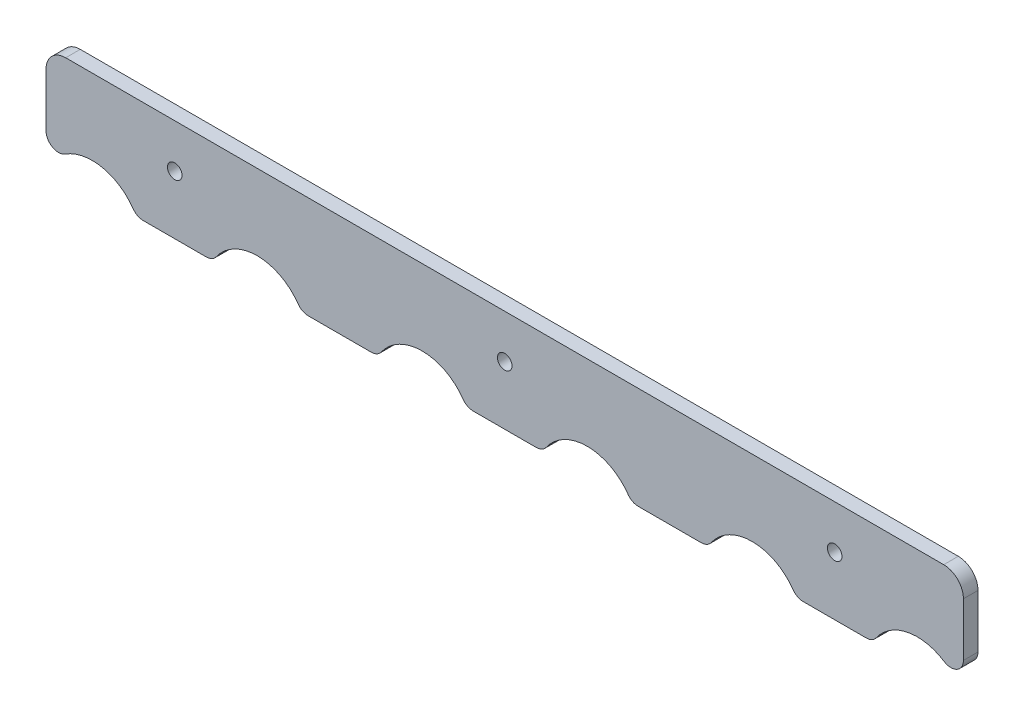
ISO-10303-21;
HEADER;
FILE_DESCRIPTION(('STEP AP214'),'2;1');
FILE_NAME('part.step','',(''),(''),'','','');
FILE_SCHEMA(('AUTOMOTIVE_DESIGN { 1 0 10303 214 1 1 1 1 }'));
ENDSEC;
DATA;
#1=APPLICATION_CONTEXT('core data for automotive mechanical design processes');
#2=APPLICATION_PROTOCOL_DEFINITION('international standard','automotive_design',2000,#1);
#3=PRODUCT_CONTEXT('',#1,'mechanical');
#4=PRODUCT('Part','Part','',(#3));
#5=PRODUCT_RELATED_PRODUCT_CATEGORY('part','',(#4));
#6=PRODUCT_DEFINITION_FORMATION('','',#4);
#7=PRODUCT_DEFINITION_CONTEXT('part definition',#1,'design');
#8=PRODUCT_DEFINITION('design','',#6,#7);
#9=PRODUCT_DEFINITION_SHAPE('','',#8);
#10=(LENGTH_UNIT() NAMED_UNIT(*) SI_UNIT(.MILLI.,.METRE.));
#11=(NAMED_UNIT(*) PLANE_ANGLE_UNIT() SI_UNIT($,.RADIAN.));
#12=(NAMED_UNIT(*) SI_UNIT($,.STERADIAN.) SOLID_ANGLE_UNIT());
#13=UNCERTAINTY_MEASURE_WITH_UNIT(LENGTH_MEASURE(1.E-05),#10,'distance_accuracy_value','');
#14=(GEOMETRIC_REPRESENTATION_CONTEXT(3) GLOBAL_UNCERTAINTY_ASSIGNED_CONTEXT((#13)) GLOBAL_UNIT_ASSIGNED_CONTEXT((#10,
#11,#12)) REPRESENTATION_CONTEXT('',''));
#15=CARTESIAN_POINT('',(0.,0.,0.));
#16=DIRECTION('',(0.,0.,1.));
#17=DIRECTION('',(1.,0.,0.));
#18=AXIS2_PLACEMENT_3D('',#15,#16,#17);
#19=CARTESIAN_POINT('',(0.,0.,2.032));
#20=DIRECTION('',(0.,0.,1.));
#21=DIRECTION('',(1.,0.,0.));
#22=AXIS2_PLACEMENT_3D('',#19,#20,#21);
#23=PLANE('',#22);
#24=CARTESIAN_POINT('',(114.275,22.185,2.032));
#25=DIRECTION('',(0.,0.,-1.));
#26=DIRECTION('',(-1.,0.,0.));
#27=AXIS2_PLACEMENT_3D('',#24,#25,#26);
#28=CIRCLE('',#27,1.016);
#29=CARTESIAN_POINT('',(113.259,22.185,2.032));
#30=VERTEX_POINT('',#29);
#31=EDGE_CURVE('E50',#30,#30,#28,.T.);
#32=ORIENTED_EDGE('',*,*,#31,.T.);
#33=EDGE_LOOP('',(#32));
#34=FACE_BOUND('',#33,.T.);
#35=CARTESIAN_POINT('',(68.275,22.185,2.032));
#36=DIRECTION('',(0.,0.,-1.));
#37=DIRECTION('',(-1.,0.,0.));
#38=AXIS2_PLACEMENT_3D('',#35,#36,#37);
#39=CIRCLE('',#38,1.016);
#40=CARTESIAN_POINT('',(67.259,22.185,2.032));
#41=VERTEX_POINT('',#40);
#42=EDGE_CURVE('E578',#41,#41,#39,.T.);
#43=ORIENTED_EDGE('',*,*,#42,.T.);
#44=EDGE_LOOP('',(#43));
#45=FACE_BOUND('',#44,.T.);
#46=CARTESIAN_POINT('',(22.275,22.185,2.032));
#47=DIRECTION('',(0.,0.,-1.));
#48=DIRECTION('',(-1.,0.,0.));
#49=AXIS2_PLACEMENT_3D('',#46,#47,#48);
#50=CIRCLE('',#49,1.016);
#51=CARTESIAN_POINT('',(21.259,22.185,2.032));
#52=VERTEX_POINT('',#51);
#53=EDGE_CURVE('E12',#52,#52,#50,.T.);
#54=ORIENTED_EDGE('',*,*,#53,.T.);
#55=EDGE_LOOP('',(#54));
#56=FACE_BOUND('',#55,.T.);
#57=DIRECTION('',(-1.,0.,0.));
#58=VECTOR('',#57,1.);
#59=CARTESIAN_POINT('',(129.475,28.281,2.032));
#60=LINE('',#59,#58);
#61=CARTESIAN_POINT('',(129.475,28.281,2.032));
#62=VERTEX_POINT('',#61);
#63=CARTESIAN_POINT('',(7.075,28.281,2.032));
#64=VERTEX_POINT('',#63);
#65=EDGE_CURVE('E382',#62,#64,#60,.T.);
#66=ORIENTED_EDGE('',*,*,#65,.T.);
#67=CARTESIAN_POINT('',(7.075,25.535,2.032));
#68=DIRECTION('',(0.,0.,1.));
#69=DIRECTION('',(1.,0.,0.));
#70=AXIS2_PLACEMENT_3D('',#67,#68,#69);
#71=CIRCLE('',#70,2.746);
#72=CARTESIAN_POINT('',(4.329,25.535,2.032));
#73=VERTEX_POINT('',#72);
#74=EDGE_CURVE('E374',#64,#73,#71,.T.);
#75=ORIENTED_EDGE('',*,*,#74,.T.);
#76=DIRECTION('',(0.,-1.,0.));
#77=VECTOR('',#76,1.);
#78=CARTESIAN_POINT('',(4.329,25.535,2.032));
#79=LINE('',#78,#77);
#80=CARTESIAN_POINT('',(4.329,18.0962020870892,2.032));
#81=VERTEX_POINT('',#80);
#82=EDGE_CURVE('E630',#73,#81,#79,.T.);
#83=ORIENTED_EDGE('',*,*,#82,.T.);
#84=CARTESIAN_POINT('',(6.075,18.0962020870892,2.032));
#85=DIRECTION('',(0.,0.,1.));
#86=DIRECTION('',(1.,0.,0.));
#87=AXIS2_PLACEMENT_3D('',#84,#85,#86);
#88=CIRCLE('',#87,1.746);
#89=CARTESIAN_POINT('',(7.01824137931034,16.6269125647838,2.032));
#90=VERTEX_POINT('',#89);
#91=EDGE_CURVE('E63',#81,#90,#88,.T.);
#92=ORIENTED_EDGE('',*,*,#91,.T.);
#93=CARTESIAN_POINT('',(10.775,10.775,2.032));
#94=DIRECTION('',(0.,0.,-1.));
#95=DIRECTION('',(1.,0.,0.));
#96=AXIS2_PLACEMENT_3D('',#93,#94,#95);
#97=CIRCLE('',#96,6.954);
#98=CARTESIAN_POINT('',(16.4658426718976,14.7715517241379,2.032));
#99=VERTEX_POINT('',#98);
#100=EDGE_CURVE('E240',#90,#99,#97,.T.);
#101=ORIENTED_EDGE('',*,*,#100,.T.);
#102=CARTESIAN_POINT('',(17.894691004531,15.775,2.032));
#103=DIRECTION('',(0.,0.,1.));
#104=DIRECTION('',(1.,0.,0.));
#105=AXIS2_PLACEMENT_3D('',#102,#103,#104);
#106=CIRCLE('',#105,1.746);
#107=CARTESIAN_POINT('',(17.894691004531,14.029,2.032));
#108=VERTEX_POINT('',#107);
#109=EDGE_CURVE('E567',#99,#108,#106,.T.);
#110=ORIENTED_EDGE('',*,*,#109,.T.);
#111=DIRECTION('',(1.,0.,0.));
#112=VECTOR('',#111,1.);
#113=CARTESIAN_POINT('',(17.894691004531,14.029,2.032));
#114=LINE('',#113,#112);
#115=CARTESIAN_POINT('',(26.655308995469,14.029,2.032));
#116=VERTEX_POINT('',#115);
#117=EDGE_CURVE('E561',#108,#116,#114,.T.);
#118=ORIENTED_EDGE('',*,*,#117,.T.);
#119=CARTESIAN_POINT('',(26.655308995469,15.775,2.032));
#120=DIRECTION('',(0.,0.,1.));
#121=DIRECTION('',(1.,0.,0.));
#122=AXIS2_PLACEMENT_3D('',#119,#120,#121);
#123=CIRCLE('',#122,1.746);
#124=CARTESIAN_POINT('',(28.0841573281024,14.7715517241379,2.032));
#125=VERTEX_POINT('',#124);
#126=EDGE_CURVE('E554',#116,#125,#123,.T.);
#127=ORIENTED_EDGE('',*,*,#126,.T.);
#128=CARTESIAN_POINT('',(33.775,10.775,2.032));
#129=DIRECTION('',(0.,0.,-1.));
#130=DIRECTION('',(1.,0.,0.));
#131=AXIS2_PLACEMENT_3D('',#128,#129,#130);
#132=CIRCLE('',#131,6.954);
#133=CARTESIAN_POINT('',(39.4658426718976,14.7715517241379,2.032));
#134=VERTEX_POINT('',#133);
#135=EDGE_CURVE('E624',#125,#134,#132,.T.);
#136=ORIENTED_EDGE('',*,*,#135,.T.);
#137=CARTESIAN_POINT('',(40.894691004531,15.775,2.032));
#138=DIRECTION('',(0.,0.,1.));
#139=DIRECTION('',(1.,0.,0.));
#140=AXIS2_PLACEMENT_3D('',#137,#138,#139);
#141=CIRCLE('',#140,1.746);
#142=CARTESIAN_POINT('',(40.894691004531,14.029,2.032));
#143=VERTEX_POINT('',#142);
#144=EDGE_CURVE('E541',#134,#143,#141,.T.);
#145=ORIENTED_EDGE('',*,*,#144,.T.);
#146=DIRECTION('',(1.,0.,0.));
#147=VECTOR('',#146,1.);
#148=CARTESIAN_POINT('',(40.894691004531,14.029,2.032));
#149=LINE('',#148,#147);
#150=CARTESIAN_POINT('',(49.655308995469,14.029,2.032));
#151=VERTEX_POINT('',#150);
#152=EDGE_CURVE('E534',#143,#151,#149,.T.);
#153=ORIENTED_EDGE('',*,*,#152,.T.);
#154=CARTESIAN_POINT('',(49.655308995469,15.775,2.032));
#155=DIRECTION('',(0.,0.,1.));
#156=DIRECTION('',(1.,0.,0.));
#157=AXIS2_PLACEMENT_3D('',#154,#155,#156);
#158=CIRCLE('',#157,1.746);
#159=CARTESIAN_POINT('',(51.0841573281024,14.7715517241379,2.032));
#160=VERTEX_POINT('',#159);
#161=EDGE_CURVE('E620',#151,#160,#158,.T.);
#162=ORIENTED_EDGE('',*,*,#161,.T.);
#163=CARTESIAN_POINT('',(56.775,10.775,2.032));
#164=DIRECTION('',(0.,0.,-1.));
#165=DIRECTION('',(1.,0.,0.));
#166=AXIS2_PLACEMENT_3D('',#163,#164,#165);
#167=CIRCLE('',#166,6.95400000000001);
#168=CARTESIAN_POINT('',(62.4658426718976,14.7715517241379,2.032));
#169=VERTEX_POINT('',#168);
#170=EDGE_CURVE('E518',#160,#169,#167,.T.);
#171=ORIENTED_EDGE('',*,*,#170,.T.);
#172=CARTESIAN_POINT('',(63.894691004531,15.775,2.032));
#173=DIRECTION('',(0.,0.,1.));
#174=DIRECTION('',(1.,0.,0.));
#175=AXIS2_PLACEMENT_3D('',#172,#173,#174);
#176=CIRCLE('',#175,1.746);
#177=CARTESIAN_POINT('',(63.894691004531,14.029,2.032));
#178=VERTEX_POINT('',#177);
#179=EDGE_CURVE('E511',#169,#178,#176,.T.);
#180=ORIENTED_EDGE('',*,*,#179,.T.);
#181=DIRECTION('',(1.,0.,0.));
#182=VECTOR('',#181,1.);
#183=CARTESIAN_POINT('',(63.894691004531,14.029,2.032));
#184=LINE('',#183,#182);
#185=CARTESIAN_POINT('',(72.655308995469,14.029,2.032));
#186=VERTEX_POINT('',#185);
#187=EDGE_CURVE('E616',#178,#186,#184,.T.);
#188=ORIENTED_EDGE('',*,*,#187,.T.);
#189=CARTESIAN_POINT('',(72.655308995469,15.775,2.032));
#190=DIRECTION('',(0.,0.,1.));
#191=DIRECTION('',(1.,0.,0.));
#192=AXIS2_PLACEMENT_3D('',#189,#190,#191);
#193=CIRCLE('',#192,1.746);
#194=CARTESIAN_POINT('',(74.0841573281024,14.7715517241379,2.032));
#195=VERTEX_POINT('',#194);
#196=EDGE_CURVE('E495',#186,#195,#193,.T.);
#197=ORIENTED_EDGE('',*,*,#196,.T.);
#198=CARTESIAN_POINT('',(79.775,10.775,2.032));
#199=DIRECTION('',(0.,0.,-1.));
#200=DIRECTION('',(1.,0.,0.));
#201=AXIS2_PLACEMENT_3D('',#198,#199,#200);
#202=CIRCLE('',#201,6.95400000000001);
#203=CARTESIAN_POINT('',(85.4658426718976,14.7715517241379,2.032));
#204=VERTEX_POINT('',#203);
#205=EDGE_CURVE('E488',#195,#204,#202,.T.);
#206=ORIENTED_EDGE('',*,*,#205,.T.);
#207=CARTESIAN_POINT('',(86.894691004531,15.775,2.032));
#208=DIRECTION('',(0.,0.,1.));
#209=DIRECTION('',(1.,0.,0.));
#210=AXIS2_PLACEMENT_3D('',#207,#208,#209);
#211=CIRCLE('',#210,1.74599999999999);
#212=CARTESIAN_POINT('',(86.894691004531,14.029,2.032));
#213=VERTEX_POINT('',#212);
#214=EDGE_CURVE('E612',#204,#213,#211,.T.);
#215=ORIENTED_EDGE('',*,*,#214,.T.);
#216=DIRECTION('',(1.,0.,0.));
#217=VECTOR('',#216,1.);
#218=CARTESIAN_POINT('',(86.894691004531,14.029,2.032));
#219=LINE('',#218,#217);
#220=CARTESIAN_POINT('',(95.655308995469,14.029,2.032));
#221=VERTEX_POINT('',#220);
#222=EDGE_CURVE('E473',#213,#221,#219,.T.);
#223=ORIENTED_EDGE('',*,*,#222,.T.);
#224=CARTESIAN_POINT('',(95.655308995469,15.775,2.032));
#225=DIRECTION('',(0.,0.,1.));
#226=DIRECTION('',(1.,0.,0.));
#227=AXIS2_PLACEMENT_3D('',#224,#225,#226);
#228=CIRCLE('',#227,1.746);
#229=CARTESIAN_POINT('',(97.0841573281024,14.7715517241379,2.032));
#230=VERTEX_POINT('',#229);
#231=EDGE_CURVE('E465',#221,#230,#228,.T.);
#232=ORIENTED_EDGE('',*,*,#231,.T.);
#233=CARTESIAN_POINT('',(102.775,10.775,2.032));
#234=DIRECTION('',(0.,0.,-1.));
#235=DIRECTION('',(1.,0.,0.));
#236=AXIS2_PLACEMENT_3D('',#233,#234,#235);
#237=CIRCLE('',#236,6.95400000000001);
#238=CARTESIAN_POINT('',(108.465842671898,14.7715517241379,2.032));
#239=VERTEX_POINT('',#238);
#240=EDGE_CURVE('E608',#230,#239,#237,.T.);
#241=ORIENTED_EDGE('',*,*,#240,.T.);
#242=CARTESIAN_POINT('',(109.894691004531,15.775,2.032));
#243=DIRECTION('',(0.,0.,1.));
#244=DIRECTION('',(1.,0.,0.));
#245=AXIS2_PLACEMENT_3D('',#242,#243,#244);
#246=CIRCLE('',#245,1.74599999999999);
#247=CARTESIAN_POINT('',(109.894691004531,14.029,2.032));
#248=VERTEX_POINT('',#247);
#249=EDGE_CURVE('E450',#239,#248,#246,.T.);
#250=ORIENTED_EDGE('',*,*,#249,.T.);
#251=DIRECTION('',(1.,0.,0.));
#252=VECTOR('',#251,1.);
#253=CARTESIAN_POINT('',(109.894691004531,14.029,2.032));
#254=LINE('',#253,#252);
#255=CARTESIAN_POINT('',(118.655308995469,14.029,2.032));
#256=VERTEX_POINT('',#255);
#257=EDGE_CURVE('E443',#248,#256,#254,.T.);
#258=ORIENTED_EDGE('',*,*,#257,.T.);
#259=CARTESIAN_POINT('',(118.655308995469,15.775,2.032));
#260=DIRECTION('',(0.,0.,1.));
#261=DIRECTION('',(1.,0.,0.));
#262=AXIS2_PLACEMENT_3D('',#259,#260,#261);
#263=CIRCLE('',#262,1.746);
#264=CARTESIAN_POINT('',(120.084157328102,14.7715517241379,2.032));
#265=VERTEX_POINT('',#264);
#266=EDGE_CURVE('E604',#256,#265,#263,.T.);
#267=ORIENTED_EDGE('',*,*,#266,.T.);
#268=CARTESIAN_POINT('',(125.775,10.775,2.032));
#269=DIRECTION('',(0.,0.,-1.));
#270=DIRECTION('',(1.,0.,0.));
#271=AXIS2_PLACEMENT_3D('',#268,#269,#270);
#272=CIRCLE('',#271,6.95400000000001);
#273=CARTESIAN_POINT('',(129.53175862069,16.6269125647838,2.032));
#274=VERTEX_POINT('',#273);
#275=EDGE_CURVE('E427',#265,#274,#272,.T.);
#276=ORIENTED_EDGE('',*,*,#275,.T.);
#277=CARTESIAN_POINT('',(130.475,18.0962020870892,2.032));
#278=DIRECTION('',(0.,0.,1.));
#279=DIRECTION('',(1.,0.,0.));
#280=AXIS2_PLACEMENT_3D('',#277,#278,#279);
#281=CIRCLE('',#280,1.746);
#282=CARTESIAN_POINT('',(132.221,18.0962020870892,2.032));
#283=VERTEX_POINT('',#282);
#284=EDGE_CURVE('E420',#274,#283,#281,.T.);
#285=ORIENTED_EDGE('',*,*,#284,.T.);
#286=DIRECTION('',(0.,1.,0.));
#287=VECTOR('',#286,1.);
#288=CARTESIAN_POINT('',(132.221,18.0962020870892,2.032));
#289=LINE('',#288,#287);
#290=CARTESIAN_POINT('',(132.221,25.535,2.032));
#291=VERTEX_POINT('',#290);
#292=EDGE_CURVE('E600',#283,#291,#289,.T.);
#293=ORIENTED_EDGE('',*,*,#292,.T.);
#294=CARTESIAN_POINT('',(129.475,25.535,2.032));
#295=DIRECTION('',(0.,0.,1.));
#296=DIRECTION('',(1.,0.,0.));
#297=AXIS2_PLACEMENT_3D('',#294,#295,#296);
#298=CIRCLE('',#297,2.746);
#299=EDGE_CURVE('E404',#291,#62,#298,.T.);
#300=ORIENTED_EDGE('',*,*,#299,.T.);
#301=EDGE_LOOP('',(#66,#75,#83,#92,#101,#110,#118,#127,#136,#145,#153,#162,#171,#180,#188,#197,
#206,#215,#223,#232,#241,#250,#258,#267,#276,#285,#293,#300));
#302=FACE_BOUND('',#301,.T.);
#303=ADVANCED_FACE('F46',(#34,#45,#56,#302),#23,.T.);
#304=CARTESIAN_POINT('',(0.,0.,0.));
#305=DIRECTION('',(0.,0.,1.));
#306=DIRECTION('',(1.,0.,0.));
#307=AXIS2_PLACEMENT_3D('',#304,#305,#306);
#308=PLANE('',#307);
#309=CARTESIAN_POINT('',(114.275,22.185,0.));
#310=DIRECTION('',(0.,0.,-1.));
#311=DIRECTION('',(-1.,0.,0.));
#312=AXIS2_PLACEMENT_3D('',#309,#310,#311);
#313=CIRCLE('',#312,1.016);
#314=CARTESIAN_POINT('',(113.259,22.185,0.));
#315=VERTEX_POINT('',#314);
#316=EDGE_CURVE('E580',#315,#315,#313,.T.);
#317=ORIENTED_EDGE('',*,*,#316,.F.);
#318=EDGE_LOOP('',(#317));
#319=FACE_BOUND('',#318,.T.);
#320=CARTESIAN_POINT('',(68.275,22.185,0.));
#321=DIRECTION('',(0.,0.,-1.));
#322=DIRECTION('',(-1.,0.,0.));
#323=AXIS2_PLACEMENT_3D('',#320,#321,#322);
#324=CIRCLE('',#323,1.016);
#325=CARTESIAN_POINT('',(67.259,22.185,0.));
#326=VERTEX_POINT('',#325);
#327=EDGE_CURVE('E574',#326,#326,#324,.T.);
#328=ORIENTED_EDGE('',*,*,#327,.F.);
#329=EDGE_LOOP('',(#328));
#330=FACE_BOUND('',#329,.T.);
#331=CARTESIAN_POINT('',(22.275,22.185,0.));
#332=DIRECTION('',(0.,0.,-1.));
#333=DIRECTION('',(-1.,0.,0.));
#334=AXIS2_PLACEMENT_3D('',#331,#332,#333);
#335=CIRCLE('',#334,1.016);
#336=CARTESIAN_POINT('',(21.259,22.185,0.));
#337=VERTEX_POINT('',#336);
#338=EDGE_CURVE('E55',#337,#337,#335,.T.);
#339=ORIENTED_EDGE('',*,*,#338,.F.);
#340=EDGE_LOOP('',(#339));
#341=FACE_BOUND('',#340,.T.);
#342=CARTESIAN_POINT('',(7.075,25.535,0.));
#343=DIRECTION('',(0.,0.,1.));
#344=DIRECTION('',(1.,0.,0.));
#345=AXIS2_PLACEMENT_3D('',#342,#343,#344);
#346=CIRCLE('',#345,2.746);
#347=CARTESIAN_POINT('',(7.075,28.281,0.));
#348=VERTEX_POINT('',#347);
#349=CARTESIAN_POINT('',(4.329,25.535,0.));
#350=VERTEX_POINT('',#349);
#351=EDGE_CURVE('E71',#348,#350,#346,.T.);
#352=ORIENTED_EDGE('',*,*,#351,.F.);
#353=DIRECTION('',(-1.,0.,0.));
#354=VECTOR('',#353,1.);
#355=CARTESIAN_POINT('',(129.475,28.281,0.));
#356=LINE('',#355,#354);
#357=CARTESIAN_POINT('',(129.475,28.281,0.));
#358=VERTEX_POINT('',#357);
#359=EDGE_CURVE('E369',#358,#348,#356,.T.);
#360=ORIENTED_EDGE('',*,*,#359,.F.);
#361=CARTESIAN_POINT('',(129.475,25.535,0.));
#362=DIRECTION('',(0.,0.,1.));
#363=DIRECTION('',(1.,0.,0.));
#364=AXIS2_PLACEMENT_3D('',#361,#362,#363);
#365=CIRCLE('',#364,2.746);
#366=CARTESIAN_POINT('',(132.221,25.535,0.));
#367=VERTEX_POINT('',#366);
#368=EDGE_CURVE('E365',#367,#358,#365,.T.);
#369=ORIENTED_EDGE('',*,*,#368,.F.);
#370=DIRECTION('',(0.,1.,0.));
#371=VECTOR('',#370,1.);
#372=CARTESIAN_POINT('',(132.221,18.0962020870892,0.));
#373=LINE('',#372,#371);
#374=CARTESIAN_POINT('',(132.221,18.0962020870892,0.));
#375=VERTEX_POINT('',#374);
#376=EDGE_CURVE('E362',#375,#367,#373,.T.);
#377=ORIENTED_EDGE('',*,*,#376,.F.);
#378=CARTESIAN_POINT('',(130.475,18.0962020870892,0.));
#379=DIRECTION('',(0.,0.,1.));
#380=DIRECTION('',(1.,0.,0.));
#381=AXIS2_PLACEMENT_3D('',#378,#379,#380);
#382=CIRCLE('',#381,1.746);
#383=CARTESIAN_POINT('',(129.53175862069,16.6269125647838,0.));
#384=VERTEX_POINT('',#383);
#385=EDGE_CURVE('E354',#384,#375,#382,.T.);
#386=ORIENTED_EDGE('',*,*,#385,.F.);
#387=CARTESIAN_POINT('',(125.775,10.775,0.));
#388=DIRECTION('',(0.,0.,-1.));
#389=DIRECTION('',(1.,0.,0.));
#390=AXIS2_PLACEMENT_3D('',#387,#388,#389);
#391=CIRCLE('',#390,6.95400000000001);
#392=CARTESIAN_POINT('',(120.084157328102,14.7715517241379,0.));
#393=VERTEX_POINT('',#392);
#394=EDGE_CURVE('E350',#393,#384,#391,.T.);
#395=ORIENTED_EDGE('',*,*,#394,.F.);
#396=CARTESIAN_POINT('',(118.655308995469,15.775,0.));
#397=DIRECTION('',(0.,0.,1.));
#398=DIRECTION('',(1.,0.,0.));
#399=AXIS2_PLACEMENT_3D('',#396,#397,#398);
#400=CIRCLE('',#399,1.746);
#401=CARTESIAN_POINT('',(118.655308995469,14.029,0.));
#402=VERTEX_POINT('',#401);
#403=EDGE_CURVE('E346',#402,#393,#400,.T.);
#404=ORIENTED_EDGE('',*,*,#403,.F.);
#405=DIRECTION('',(1.,0.,0.));
#406=VECTOR('',#405,1.);
#407=CARTESIAN_POINT('',(109.894691004531,14.029,0.));
#408=LINE('',#407,#406);
#409=CARTESIAN_POINT('',(109.894691004531,14.029,0.));
#410=VERTEX_POINT('',#409);
#411=EDGE_CURVE('E343',#410,#402,#408,.T.);
#412=ORIENTED_EDGE('',*,*,#411,.F.);
#413=CARTESIAN_POINT('',(109.894691004531,15.775,0.));
#414=DIRECTION('',(0.,0.,1.));
#415=DIRECTION('',(1.,0.,0.));
#416=AXIS2_PLACEMENT_3D('',#413,#414,#415);
#417=CIRCLE('',#416,1.74599999999999);
#418=CARTESIAN_POINT('',(108.465842671898,14.7715517241379,0.));
#419=VERTEX_POINT('',#418);
#420=EDGE_CURVE('E335',#419,#410,#417,.T.);
#421=ORIENTED_EDGE('',*,*,#420,.F.);
#422=CARTESIAN_POINT('',(102.775,10.775,0.));
#423=DIRECTION('',(0.,0.,-1.));
#424=DIRECTION('',(1.,0.,0.));
#425=AXIS2_PLACEMENT_3D('',#422,#423,#424);
#426=CIRCLE('',#425,6.95400000000001);
#427=CARTESIAN_POINT('',(97.0841573281024,14.7715517241379,0.));
#428=VERTEX_POINT('',#427);
#429=EDGE_CURVE('E331',#428,#419,#426,.T.);
#430=ORIENTED_EDGE('',*,*,#429,.F.);
#431=CARTESIAN_POINT('',(95.655308995469,15.775,0.));
#432=DIRECTION('',(0.,0.,1.));
#433=DIRECTION('',(1.,0.,0.));
#434=AXIS2_PLACEMENT_3D('',#431,#432,#433);
#435=CIRCLE('',#434,1.746);
#436=CARTESIAN_POINT('',(95.655308995469,14.029,0.));
#437=VERTEX_POINT('',#436);
#438=EDGE_CURVE('E327',#437,#428,#435,.T.);
#439=ORIENTED_EDGE('',*,*,#438,.F.);
#440=DIRECTION('',(1.,0.,0.));
#441=VECTOR('',#440,1.);
#442=CARTESIAN_POINT('',(86.894691004531,14.029,0.));
#443=LINE('',#442,#441);
#444=CARTESIAN_POINT('',(86.894691004531,14.029,0.));
#445=VERTEX_POINT('',#444);
#446=EDGE_CURVE('E324',#445,#437,#443,.T.);
#447=ORIENTED_EDGE('',*,*,#446,.F.);
#448=CARTESIAN_POINT('',(86.894691004531,15.775,0.));
#449=DIRECTION('',(0.,0.,1.));
#450=DIRECTION('',(1.,0.,0.));
#451=AXIS2_PLACEMENT_3D('',#448,#449,#450);
#452=CIRCLE('',#451,1.74599999999999);
#453=CARTESIAN_POINT('',(85.4658426718976,14.7715517241379,0.));
#454=VERTEX_POINT('',#453);
#455=EDGE_CURVE('E316',#454,#445,#452,.T.);
#456=ORIENTED_EDGE('',*,*,#455,.F.);
#457=CARTESIAN_POINT('',(79.775,10.775,0.));
#458=DIRECTION('',(0.,0.,-1.));
#459=DIRECTION('',(1.,0.,0.));
#460=AXIS2_PLACEMENT_3D('',#457,#458,#459);
#461=CIRCLE('',#460,6.95400000000001);
#462=CARTESIAN_POINT('',(74.0841573281024,14.7715517241379,0.));
#463=VERTEX_POINT('',#462);
#464=EDGE_CURVE('E312',#463,#454,#461,.T.);
#465=ORIENTED_EDGE('',*,*,#464,.F.);
#466=CARTESIAN_POINT('',(72.655308995469,15.775,0.));
#467=DIRECTION('',(0.,0.,1.));
#468=DIRECTION('',(1.,0.,0.));
#469=AXIS2_PLACEMENT_3D('',#466,#467,#468);
#470=CIRCLE('',#469,1.746);
#471=CARTESIAN_POINT('',(72.655308995469,14.029,0.));
#472=VERTEX_POINT('',#471);
#473=EDGE_CURVE('E308',#472,#463,#470,.T.);
#474=ORIENTED_EDGE('',*,*,#473,.F.);
#475=DIRECTION('',(1.,0.,0.));
#476=VECTOR('',#475,1.);
#477=CARTESIAN_POINT('',(63.894691004531,14.029,0.));
#478=LINE('',#477,#476);
#479=CARTESIAN_POINT('',(63.894691004531,14.029,0.));
#480=VERTEX_POINT('',#479);
#481=EDGE_CURVE('E305',#480,#472,#478,.T.);
#482=ORIENTED_EDGE('',*,*,#481,.F.);
#483=CARTESIAN_POINT('',(63.894691004531,15.775,0.));
#484=DIRECTION('',(0.,0.,1.));
#485=DIRECTION('',(1.,0.,0.));
#486=AXIS2_PLACEMENT_3D('',#483,#484,#485);
#487=CIRCLE('',#486,1.746);
#488=CARTESIAN_POINT('',(62.4658426718976,14.7715517241379,0.));
#489=VERTEX_POINT('',#488);
#490=EDGE_CURVE('E297',#489,#480,#487,.T.);
#491=ORIENTED_EDGE('',*,*,#490,.F.);
#492=CARTESIAN_POINT('',(56.775,10.775,0.));
#493=DIRECTION('',(0.,0.,-1.));
#494=DIRECTION('',(1.,0.,0.));
#495=AXIS2_PLACEMENT_3D('',#492,#493,#494);
#496=CIRCLE('',#495,6.95400000000001);
#497=CARTESIAN_POINT('',(51.0841573281024,14.7715517241379,0.));
#498=VERTEX_POINT('',#497);
#499=EDGE_CURVE('E293',#498,#489,#496,.T.);
#500=ORIENTED_EDGE('',*,*,#499,.F.);
#501=CARTESIAN_POINT('',(49.655308995469,15.775,0.));
#502=DIRECTION('',(0.,0.,1.));
#503=DIRECTION('',(1.,0.,0.));
#504=AXIS2_PLACEMENT_3D('',#501,#502,#503);
#505=CIRCLE('',#504,1.746);
#506=CARTESIAN_POINT('',(49.655308995469,14.029,0.));
#507=VERTEX_POINT('',#506);
#508=EDGE_CURVE('E289',#507,#498,#505,.T.);
#509=ORIENTED_EDGE('',*,*,#508,.F.);
#510=DIRECTION('',(1.,0.,0.));
#511=VECTOR('',#510,1.);
#512=CARTESIAN_POINT('',(40.894691004531,14.029,0.));
#513=LINE('',#512,#511);
#514=CARTESIAN_POINT('',(40.894691004531,14.029,0.));
#515=VERTEX_POINT('',#514);
#516=EDGE_CURVE('E286',#515,#507,#513,.T.);
#517=ORIENTED_EDGE('',*,*,#516,.F.);
#518=CARTESIAN_POINT('',(40.894691004531,15.775,0.));
#519=DIRECTION('',(0.,0.,1.));
#520=DIRECTION('',(1.,0.,0.));
#521=AXIS2_PLACEMENT_3D('',#518,#519,#520);
#522=CIRCLE('',#521,1.746);
#523=CARTESIAN_POINT('',(39.4658426718976,14.7715517241379,0.));
#524=VERTEX_POINT('',#523);
#525=EDGE_CURVE('E278',#524,#515,#522,.T.);
#526=ORIENTED_EDGE('',*,*,#525,.F.);
#527=CARTESIAN_POINT('',(33.775,10.775,0.));
#528=DIRECTION('',(0.,0.,-1.));
#529=DIRECTION('',(1.,0.,0.));
#530=AXIS2_PLACEMENT_3D('',#527,#528,#529);
#531=CIRCLE('',#530,6.954);
#532=CARTESIAN_POINT('',(28.0841573281024,14.7715517241379,0.));
#533=VERTEX_POINT('',#532);
#534=EDGE_CURVE('E274',#533,#524,#531,.T.);
#535=ORIENTED_EDGE('',*,*,#534,.F.);
#536=CARTESIAN_POINT('',(26.655308995469,15.775,0.));
#537=DIRECTION('',(0.,0.,1.));
#538=DIRECTION('',(1.,0.,0.));
#539=AXIS2_PLACEMENT_3D('',#536,#537,#538);
#540=CIRCLE('',#539,1.746);
#541=CARTESIAN_POINT('',(26.655308995469,14.029,0.));
#542=VERTEX_POINT('',#541);
#543=EDGE_CURVE('E270',#542,#533,#540,.T.);
#544=ORIENTED_EDGE('',*,*,#543,.F.);
#545=DIRECTION('',(1.,0.,0.));
#546=VECTOR('',#545,1.);
#547=CARTESIAN_POINT('',(17.894691004531,14.029,0.));
#548=LINE('',#547,#546);
#549=CARTESIAN_POINT('',(17.894691004531,14.029,0.));
#550=VERTEX_POINT('',#549);
#551=EDGE_CURVE('E256',#550,#542,#548,.T.);
#552=ORIENTED_EDGE('',*,*,#551,.F.);
#553=CARTESIAN_POINT('',(17.894691004531,15.775,0.));
#554=DIRECTION('',(0.,0.,1.));
#555=DIRECTION('',(1.,0.,0.));
#556=AXIS2_PLACEMENT_3D('',#553,#554,#555);
#557=CIRCLE('',#556,1.746);
#558=CARTESIAN_POINT('',(16.4658426718976,14.7715517241379,0.));
#559=VERTEX_POINT('',#558);
#560=EDGE_CURVE('E254',#559,#550,#557,.T.);
#561=ORIENTED_EDGE('',*,*,#560,.F.);
#562=CARTESIAN_POINT('',(10.775,10.775,0.));
#563=DIRECTION('',(0.,0.,-1.));
#564=DIRECTION('',(1.,0.,0.));
#565=AXIS2_PLACEMENT_3D('',#562,#563,#564);
#566=CIRCLE('',#565,6.954);
#567=CARTESIAN_POINT('',(7.01824137931034,16.6269125647838,0.));
#568=VERTEX_POINT('',#567);
#569=EDGE_CURVE('E237',#568,#559,#566,.T.);
#570=ORIENTED_EDGE('',*,*,#569,.F.);
#571=CARTESIAN_POINT('',(6.075,18.0962020870892,0.));
#572=DIRECTION('',(0.,0.,1.));
#573=DIRECTION('',(1.,0.,0.));
#574=AXIS2_PLACEMENT_3D('',#571,#572,#573);
#575=CIRCLE('',#574,1.746);
#576=CARTESIAN_POINT('',(4.329,18.0962020870892,0.));
#577=VERTEX_POINT('',#576);
#578=EDGE_CURVE('E245',#577,#568,#575,.T.);
#579=ORIENTED_EDGE('',*,*,#578,.F.);
#580=DIRECTION('',(0.,-1.,0.));
#581=VECTOR('',#580,1.);
#582=CARTESIAN_POINT('',(4.329,25.535,0.));
#583=LINE('',#582,#581);
#584=EDGE_CURVE('E250',#350,#577,#583,.T.);
#585=ORIENTED_EDGE('',*,*,#584,.F.);
#586=EDGE_LOOP('',(#352,#360,#369,#377,#386,#395,#404,#412,#421,#430,#439,#447,#456,#465,#474,
#482,#491,#500,#509,#517,#526,#535,#544,#552,#561,#570,#579,#585));
#587=FACE_BOUND('',#586,.T.);
#588=ADVANCED_FACE('F48',(#319,#330,#341,#587),#308,.F.);
#589=CARTESIAN_POINT('',(114.275,22.185,2.032));
#590=DIRECTION('',(0.,0.,-1.));
#591=DIRECTION('',(-1.,0.,0.));
#592=AXIS2_PLACEMENT_3D('',#589,#590,#591);
#593=CYLINDRICAL_SURFACE('',#592,1.016);
#594=ORIENTED_EDGE('',*,*,#31,.F.);
#595=EDGE_LOOP('',(#594));
#596=FACE_BOUND('',#595,.T.);
#597=ORIENTED_EDGE('',*,*,#316,.T.);
#598=EDGE_LOOP('',(#597));
#599=FACE_BOUND('',#598,.T.);
#600=ADVANCED_FACE('F650',(#596,#599),#593,.F.);
#601=CARTESIAN_POINT('',(68.275,22.185,2.032));
#602=DIRECTION('',(0.,0.,-1.));
#603=DIRECTION('',(-1.,0.,0.));
#604=AXIS2_PLACEMENT_3D('',#601,#602,#603);
#605=CYLINDRICAL_SURFACE('',#604,1.016);
#606=ORIENTED_EDGE('',*,*,#42,.F.);
#607=EDGE_LOOP('',(#606));
#608=FACE_BOUND('',#607,.T.);
#609=ORIENTED_EDGE('',*,*,#327,.T.);
#610=EDGE_LOOP('',(#609));
#611=FACE_BOUND('',#610,.T.);
#612=ADVANCED_FACE('F643',(#608,#611),#605,.F.);
#613=CARTESIAN_POINT('',(22.275,22.185,2.032));
#614=DIRECTION('',(0.,0.,-1.));
#615=DIRECTION('',(-1.,0.,0.));
#616=AXIS2_PLACEMENT_3D('',#613,#614,#615);
#617=CYLINDRICAL_SURFACE('',#616,1.016);
#618=ORIENTED_EDGE('',*,*,#53,.F.);
#619=EDGE_LOOP('',(#618));
#620=FACE_BOUND('',#619,.T.);
#621=ORIENTED_EDGE('',*,*,#338,.T.);
#622=EDGE_LOOP('',(#621));
#623=FACE_BOUND('',#622,.T.);
#624=ADVANCED_FACE('F635',(#620,#623),#617,.F.);
#625=CARTESIAN_POINT('',(7.075,25.535,0.));
#626=DIRECTION('',(0.,0.,1.));
#627=DIRECTION('',(1.,0.,0.));
#628=AXIS2_PLACEMENT_3D('',#625,#626,#627);
#629=CYLINDRICAL_SURFACE('',#628,2.746);
#630=ORIENTED_EDGE('',*,*,#74,.F.);
#631=DIRECTION('',(0.,0.,1.));
#632=VECTOR('',#631,1.);
#633=CARTESIAN_POINT('',(7.075,28.281,0.));
#634=LINE('',#633,#632);
#635=EDGE_CURVE('E394',#348,#64,#634,.T.);
#636=ORIENTED_EDGE('',*,*,#635,.F.);
#637=ORIENTED_EDGE('',*,*,#351,.T.);
#638=DIRECTION('',(0.,0.,1.));
#639=VECTOR('',#638,1.);
#640=CARTESIAN_POINT('',(4.329,25.535,0.));
#641=LINE('',#640,#639);
#642=EDGE_CURVE('E373',#350,#73,#641,.T.);
#643=ORIENTED_EDGE('',*,*,#642,.T.);
#644=EDGE_LOOP('',(#630,#636,#637,#643));
#645=FACE_BOUND('',#644,.T.);
#646=ADVANCED_FACE('F633',(#645),#629,.T.);
#647=CARTESIAN_POINT('',(129.475,28.281,0.));
#648=DIRECTION('',(0.,1.,0.));
#649=DIRECTION('',(-1.,0.,0.));
#650=AXIS2_PLACEMENT_3D('',#647,#648,#649);
#651=PLANE('',#650);
#652=ORIENTED_EDGE('',*,*,#65,.F.);
#653=DIRECTION('',(0.,0.,1.));
#654=VECTOR('',#653,1.);
#655=CARTESIAN_POINT('',(129.475,28.281,0.));
#656=LINE('',#655,#654);
#657=EDGE_CURVE('E396',#358,#62,#656,.T.);
#658=ORIENTED_EDGE('',*,*,#657,.F.);
#659=ORIENTED_EDGE('',*,*,#359,.T.);
#660=ORIENTED_EDGE('',*,*,#635,.T.);
#661=EDGE_LOOP('',(#652,#658,#659,#660));
#662=FACE_BOUND('',#661,.T.);
#663=ADVANCED_FACE('F393',(#662),#651,.T.);
#664=CARTESIAN_POINT('',(129.475,25.535,0.));
#665=DIRECTION('',(0.,0.,1.));
#666=DIRECTION('',(1.,0.,0.));
#667=AXIS2_PLACEMENT_3D('',#664,#665,#666);
#668=CYLINDRICAL_SURFACE('',#667,2.746);
#669=ORIENTED_EDGE('',*,*,#299,.F.);
#670=DIRECTION('',(0.,0.,1.));
#671=VECTOR('',#670,1.);
#672=CARTESIAN_POINT('',(132.221,25.535,0.));
#673=LINE('',#672,#671);
#674=EDGE_CURVE('E401',#367,#291,#673,.T.);
#675=ORIENTED_EDGE('',*,*,#674,.F.);
#676=ORIENTED_EDGE('',*,*,#368,.T.);
#677=ORIENTED_EDGE('',*,*,#657,.T.);
#678=EDGE_LOOP('',(#669,#675,#676,#677));
#679=FACE_BOUND('',#678,.T.);
#680=ADVANCED_FACE('F403',(#679),#668,.T.);
#681=CARTESIAN_POINT('',(132.221,18.0962020870892,0.));
#682=DIRECTION('',(1.,0.,0.));
#683=DIRECTION('',(0.,0.,-1.));
#684=AXIS2_PLACEMENT_3D('',#681,#682,#683);
#685=PLANE('',#684);
#686=ORIENTED_EDGE('',*,*,#292,.F.);
#687=DIRECTION('',(0.,0.,1.));
#688=VECTOR('',#687,1.);
#689=CARTESIAN_POINT('',(132.221,18.0962020870892,0.));
#690=LINE('',#689,#688);
#691=EDGE_CURVE('E408',#375,#283,#690,.T.);
#692=ORIENTED_EDGE('',*,*,#691,.F.);
#693=ORIENTED_EDGE('',*,*,#376,.T.);
#694=ORIENTED_EDGE('',*,*,#674,.T.);
#695=EDGE_LOOP('',(#686,#692,#693,#694));
#696=FACE_BOUND('',#695,.T.);
#697=ADVANCED_FACE('F410',(#696),#685,.T.);
#698=CARTESIAN_POINT('',(130.475,18.0962020870892,0.));
#699=DIRECTION('',(0.,0.,1.));
#700=DIRECTION('',(1.,0.,0.));
#701=AXIS2_PLACEMENT_3D('',#698,#699,#700);
#702=CYLINDRICAL_SURFACE('',#701,1.746);
#703=ORIENTED_EDGE('',*,*,#284,.F.);
#704=DIRECTION('',(0.,0.,1.));
#705=VECTOR('',#704,1.);
#706=CARTESIAN_POINT('',(129.53175862069,16.6269125647838,0.));
#707=LINE('',#706,#705);
#708=EDGE_CURVE('E418',#384,#274,#707,.T.);
#709=ORIENTED_EDGE('',*,*,#708,.F.);
#710=ORIENTED_EDGE('',*,*,#385,.T.);
#711=ORIENTED_EDGE('',*,*,#691,.T.);
#712=EDGE_LOOP('',(#703,#709,#710,#711));
#713=FACE_BOUND('',#712,.T.);
#714=ADVANCED_FACE('F417',(#713),#702,.T.);
#715=CARTESIAN_POINT('',(125.775,10.775,0.));
#716=DIRECTION('',(0.,0.,1.));
#717=DIRECTION('',(1.,0.,0.));
#718=AXIS2_PLACEMENT_3D('',#715,#716,#717);
#719=CYLINDRICAL_SURFACE('',#718,6.95400000000001);
#720=ORIENTED_EDGE('',*,*,#275,.F.);
#721=DIRECTION('',(0.,0.,1.));
#722=VECTOR('',#721,1.);
#723=CARTESIAN_POINT('',(120.084157328102,14.7715517241379,0.));
#724=LINE('',#723,#722);
#725=EDGE_CURVE('E424',#393,#265,#724,.T.);
#726=ORIENTED_EDGE('',*,*,#725,.F.);
#727=ORIENTED_EDGE('',*,*,#394,.T.);
#728=ORIENTED_EDGE('',*,*,#708,.T.);
#729=EDGE_LOOP('',(#720,#726,#727,#728));
#730=FACE_BOUND('',#729,.T.);
#731=ADVANCED_FACE('F426',(#730),#719,.F.);
#732=CARTESIAN_POINT('',(118.655308995469,15.775,0.));
#733=DIRECTION('',(0.,0.,1.));
#734=DIRECTION('',(1.,0.,0.));
#735=AXIS2_PLACEMENT_3D('',#732,#733,#734);
#736=CYLINDRICAL_SURFACE('',#735,1.746);
#737=ORIENTED_EDGE('',*,*,#266,.F.);
#738=DIRECTION('',(0.,0.,1.));
#739=VECTOR('',#738,1.);
#740=CARTESIAN_POINT('',(118.655308995469,14.029,0.));
#741=LINE('',#740,#739);
#742=EDGE_CURVE('E431',#402,#256,#741,.T.);
#743=ORIENTED_EDGE('',*,*,#742,.F.);
#744=ORIENTED_EDGE('',*,*,#403,.T.);
#745=ORIENTED_EDGE('',*,*,#725,.T.);
#746=EDGE_LOOP('',(#737,#743,#744,#745));
#747=FACE_BOUND('',#746,.T.);
#748=ADVANCED_FACE('F433',(#747),#736,.T.);
#749=CARTESIAN_POINT('',(109.894691004531,14.029,0.));
#750=DIRECTION('',(0.,-1.,0.));
#751=DIRECTION('',(1.,0.,0.));
#752=AXIS2_PLACEMENT_3D('',#749,#750,#751);
#753=PLANE('',#752);
#754=ORIENTED_EDGE('',*,*,#257,.F.);
#755=DIRECTION('',(0.,0.,1.));
#756=VECTOR('',#755,1.);
#757=CARTESIAN_POINT('',(109.894691004531,14.029,0.));
#758=LINE('',#757,#756);
#759=EDGE_CURVE('E441',#410,#248,#758,.T.);
#760=ORIENTED_EDGE('',*,*,#759,.F.);
#761=ORIENTED_EDGE('',*,*,#411,.T.);
#762=ORIENTED_EDGE('',*,*,#742,.T.);
#763=EDGE_LOOP('',(#754,#760,#761,#762));
#764=FACE_BOUND('',#763,.T.);
#765=ADVANCED_FACE('F440',(#764),#753,.T.);
#766=CARTESIAN_POINT('',(109.894691004531,15.775,0.));
#767=DIRECTION('',(0.,0.,1.));
#768=DIRECTION('',(1.,0.,0.));
#769=AXIS2_PLACEMENT_3D('',#766,#767,#768);
#770=CYLINDRICAL_SURFACE('',#769,1.74599999999999);
#771=ORIENTED_EDGE('',*,*,#249,.F.);
#772=DIRECTION('',(0.,0.,1.));
#773=VECTOR('',#772,1.);
#774=CARTESIAN_POINT('',(108.465842671898,14.7715517241379,0.));
#775=LINE('',#774,#773);
#776=EDGE_CURVE('E447',#419,#239,#775,.T.);
#777=ORIENTED_EDGE('',*,*,#776,.F.);
#778=ORIENTED_EDGE('',*,*,#420,.T.);
#779=ORIENTED_EDGE('',*,*,#759,.T.);
#780=EDGE_LOOP('',(#771,#777,#778,#779));
#781=FACE_BOUND('',#780,.T.);
#782=ADVANCED_FACE('F449',(#781),#770,.T.);
#783=CARTESIAN_POINT('',(102.775,10.775,0.));
#784=DIRECTION('',(0.,0.,1.));
#785=DIRECTION('',(1.,0.,0.));
#786=AXIS2_PLACEMENT_3D('',#783,#784,#785);
#787=CYLINDRICAL_SURFACE('',#786,6.95400000000001);
#788=ORIENTED_EDGE('',*,*,#240,.F.);
#789=DIRECTION('',(0.,0.,1.));
#790=VECTOR('',#789,1.);
#791=CARTESIAN_POINT('',(97.0841573281024,14.7715517241379,0.));
#792=LINE('',#791,#790);
#793=EDGE_CURVE('E454',#428,#230,#792,.T.);
#794=ORIENTED_EDGE('',*,*,#793,.F.);
#795=ORIENTED_EDGE('',*,*,#429,.T.);
#796=ORIENTED_EDGE('',*,*,#776,.T.);
#797=EDGE_LOOP('',(#788,#794,#795,#796));
#798=FACE_BOUND('',#797,.T.);
#799=ADVANCED_FACE('F456',(#798),#787,.F.);
#800=CARTESIAN_POINT('',(95.655308995469,15.775,0.));
#801=DIRECTION('',(0.,0.,1.));
#802=DIRECTION('',(1.,0.,0.));
#803=AXIS2_PLACEMENT_3D('',#800,#801,#802);
#804=CYLINDRICAL_SURFACE('',#803,1.746);
#805=ORIENTED_EDGE('',*,*,#231,.F.);
#806=DIRECTION('',(0.,0.,1.));
#807=VECTOR('',#806,1.);
#808=CARTESIAN_POINT('',(95.655308995469,14.029,0.));
#809=LINE('',#808,#807);
#810=EDGE_CURVE('E463',#437,#221,#809,.T.);
#811=ORIENTED_EDGE('',*,*,#810,.F.);
#812=ORIENTED_EDGE('',*,*,#438,.T.);
#813=ORIENTED_EDGE('',*,*,#793,.T.);
#814=EDGE_LOOP('',(#805,#811,#812,#813));
#815=FACE_BOUND('',#814,.T.);
#816=ADVANCED_FACE('F462',(#815),#804,.T.);
#817=CARTESIAN_POINT('',(86.894691004531,14.029,0.));
#818=DIRECTION('',(0.,-1.,0.));
#819=DIRECTION('',(1.,0.,0.));
#820=AXIS2_PLACEMENT_3D('',#817,#818,#819);
#821=PLANE('',#820);
#822=ORIENTED_EDGE('',*,*,#222,.F.);
#823=DIRECTION('',(0.,0.,1.));
#824=VECTOR('',#823,1.);
#825=CARTESIAN_POINT('',(86.894691004531,14.029,0.));
#826=LINE('',#825,#824);
#827=EDGE_CURVE('E469',#445,#213,#826,.T.);
#828=ORIENTED_EDGE('',*,*,#827,.F.);
#829=ORIENTED_EDGE('',*,*,#446,.T.);
#830=ORIENTED_EDGE('',*,*,#810,.T.);
#831=EDGE_LOOP('',(#822,#828,#829,#830));
#832=FACE_BOUND('',#831,.T.);
#833=ADVANCED_FACE('F471',(#832),#821,.T.);
#834=CARTESIAN_POINT('',(86.894691004531,15.775,0.));
#835=DIRECTION('',(0.,0.,1.));
#836=DIRECTION('',(1.,0.,0.));
#837=AXIS2_PLACEMENT_3D('',#834,#835,#836);
#838=CYLINDRICAL_SURFACE('',#837,1.74599999999999);
#839=ORIENTED_EDGE('',*,*,#214,.F.);
#840=DIRECTION('',(0.,0.,1.));
#841=VECTOR('',#840,1.);
#842=CARTESIAN_POINT('',(85.4658426718976,14.7715517241379,0.));
#843=LINE('',#842,#841);
#844=EDGE_CURVE('E477',#454,#204,#843,.T.);
#845=ORIENTED_EDGE('',*,*,#844,.F.);
#846=ORIENTED_EDGE('',*,*,#455,.T.);
#847=ORIENTED_EDGE('',*,*,#827,.T.);
#848=EDGE_LOOP('',(#839,#845,#846,#847));
#849=FACE_BOUND('',#848,.T.);
#850=ADVANCED_FACE('F479',(#849),#838,.T.);
#851=CARTESIAN_POINT('',(79.775,10.775,0.));
#852=DIRECTION('',(0.,0.,1.));
#853=DIRECTION('',(1.,0.,0.));
#854=AXIS2_PLACEMENT_3D('',#851,#852,#853);
#855=CYLINDRICAL_SURFACE('',#854,6.95400000000001);
#856=ORIENTED_EDGE('',*,*,#205,.F.);
#857=DIRECTION('',(0.,0.,1.));
#858=VECTOR('',#857,1.);
#859=CARTESIAN_POINT('',(74.0841573281024,14.7715517241379,0.));
#860=LINE('',#859,#858);
#861=EDGE_CURVE('E486',#463,#195,#860,.T.);
#862=ORIENTED_EDGE('',*,*,#861,.F.);
#863=ORIENTED_EDGE('',*,*,#464,.T.);
#864=ORIENTED_EDGE('',*,*,#844,.T.);
#865=EDGE_LOOP('',(#856,#862,#863,#864));
#866=FACE_BOUND('',#865,.T.);
#867=ADVANCED_FACE('F485',(#866),#855,.F.);
#868=CARTESIAN_POINT('',(72.655308995469,15.775,0.));
#869=DIRECTION('',(0.,0.,1.));
#870=DIRECTION('',(1.,0.,0.));
#871=AXIS2_PLACEMENT_3D('',#868,#869,#870);
#872=CYLINDRICAL_SURFACE('',#871,1.746);
#873=ORIENTED_EDGE('',*,*,#196,.F.);
#874=DIRECTION('',(0.,0.,1.));
#875=VECTOR('',#874,1.);
#876=CARTESIAN_POINT('',(72.655308995469,14.029,0.));
#877=LINE('',#876,#875);
#878=EDGE_CURVE('E492',#472,#186,#877,.T.);
#879=ORIENTED_EDGE('',*,*,#878,.F.);
#880=ORIENTED_EDGE('',*,*,#473,.T.);
#881=ORIENTED_EDGE('',*,*,#861,.T.);
#882=EDGE_LOOP('',(#873,#879,#880,#881));
#883=FACE_BOUND('',#882,.T.);
#884=ADVANCED_FACE('F494',(#883),#872,.T.);
#885=CARTESIAN_POINT('',(63.894691004531,14.029,0.));
#886=DIRECTION('',(0.,-1.,0.));
#887=DIRECTION('',(0.,0.,-1.));
#888=AXIS2_PLACEMENT_3D('',#885,#886,#887);
#889=PLANE('',#888);
#890=ORIENTED_EDGE('',*,*,#187,.F.);
#891=DIRECTION('',(0.,0.,1.));
#892=VECTOR('',#891,1.);
#893=CARTESIAN_POINT('',(63.894691004531,14.029,0.));
#894=LINE('',#893,#892);
#895=EDGE_CURVE('E499',#480,#178,#894,.T.);
#896=ORIENTED_EDGE('',*,*,#895,.F.);
#897=ORIENTED_EDGE('',*,*,#481,.T.);
#898=ORIENTED_EDGE('',*,*,#878,.T.);
#899=EDGE_LOOP('',(#890,#896,#897,#898));
#900=FACE_BOUND('',#899,.T.);
#901=ADVANCED_FACE('F501',(#900),#889,.T.);
#902=CARTESIAN_POINT('',(63.894691004531,15.775,0.));
#903=DIRECTION('',(0.,0.,1.));
#904=DIRECTION('',(1.,0.,0.));
#905=AXIS2_PLACEMENT_3D('',#902,#903,#904);
#906=CYLINDRICAL_SURFACE('',#905,1.746);
#907=ORIENTED_EDGE('',*,*,#179,.F.);
#908=DIRECTION('',(0.,0.,1.));
#909=VECTOR('',#908,1.);
#910=CARTESIAN_POINT('',(62.4658426718976,14.7715517241379,0.));
#911=LINE('',#910,#909);
#912=EDGE_CURVE('E509',#489,#169,#911,.T.);
#913=ORIENTED_EDGE('',*,*,#912,.F.);
#914=ORIENTED_EDGE('',*,*,#490,.T.);
#915=ORIENTED_EDGE('',*,*,#895,.T.);
#916=EDGE_LOOP('',(#907,#913,#914,#915));
#917=FACE_BOUND('',#916,.T.);
#918=ADVANCED_FACE('F508',(#917),#906,.T.);
#919=CARTESIAN_POINT('',(56.775,10.775,0.));
#920=DIRECTION('',(0.,0.,1.));
#921=DIRECTION('',(1.,0.,0.));
#922=AXIS2_PLACEMENT_3D('',#919,#920,#921);
#923=CYLINDRICAL_SURFACE('',#922,6.95400000000001);
#924=ORIENTED_EDGE('',*,*,#170,.F.);
#925=DIRECTION('',(0.,0.,1.));
#926=VECTOR('',#925,1.);
#927=CARTESIAN_POINT('',(51.0841573281024,14.7715517241379,0.));
#928=LINE('',#927,#926);
#929=EDGE_CURVE('E515',#498,#160,#928,.T.);
#930=ORIENTED_EDGE('',*,*,#929,.F.);
#931=ORIENTED_EDGE('',*,*,#499,.T.);
#932=ORIENTED_EDGE('',*,*,#912,.T.);
#933=EDGE_LOOP('',(#924,#930,#931,#932));
#934=FACE_BOUND('',#933,.T.);
#935=ADVANCED_FACE('F517',(#934),#923,.F.);
#936=CARTESIAN_POINT('',(49.655308995469,15.775,0.));
#937=DIRECTION('',(0.,0.,1.));
#938=DIRECTION('',(1.,0.,0.));
#939=AXIS2_PLACEMENT_3D('',#936,#937,#938);
#940=CYLINDRICAL_SURFACE('',#939,1.746);
#941=ORIENTED_EDGE('',*,*,#161,.F.);
#942=DIRECTION('',(0.,0.,1.));
#943=VECTOR('',#942,1.);
#944=CARTESIAN_POINT('',(49.655308995469,14.029,0.));
#945=LINE('',#944,#943);
#946=EDGE_CURVE('E522',#507,#151,#945,.T.);
#947=ORIENTED_EDGE('',*,*,#946,.F.);
#948=ORIENTED_EDGE('',*,*,#508,.T.);
#949=ORIENTED_EDGE('',*,*,#929,.T.);
#950=EDGE_LOOP('',(#941,#947,#948,#949));
#951=FACE_BOUND('',#950,.T.);
#952=ADVANCED_FACE('F524',(#951),#940,.T.);
#953=CARTESIAN_POINT('',(40.894691004531,14.029,0.));
#954=DIRECTION('',(0.,-1.,0.));
#955=DIRECTION('',(1.,0.,0.));
#956=AXIS2_PLACEMENT_3D('',#953,#954,#955);
#957=PLANE('',#956);
#958=ORIENTED_EDGE('',*,*,#152,.F.);
#959=DIRECTION('',(0.,0.,1.));
#960=VECTOR('',#959,1.);
#961=CARTESIAN_POINT('',(40.894691004531,14.029,0.));
#962=LINE('',#961,#960);
#963=EDGE_CURVE('E532',#515,#143,#962,.T.);
#964=ORIENTED_EDGE('',*,*,#963,.F.);
#965=ORIENTED_EDGE('',*,*,#516,.T.);
#966=ORIENTED_EDGE('',*,*,#946,.T.);
#967=EDGE_LOOP('',(#958,#964,#965,#966));
#968=FACE_BOUND('',#967,.T.);
#969=ADVANCED_FACE('F531',(#968),#957,.T.);
#970=CARTESIAN_POINT('',(40.894691004531,15.775,0.));
#971=DIRECTION('',(0.,0.,1.));
#972=DIRECTION('',(1.,0.,0.));
#973=AXIS2_PLACEMENT_3D('',#970,#971,#972);
#974=CYLINDRICAL_SURFACE('',#973,1.746);
#975=ORIENTED_EDGE('',*,*,#144,.F.);
#976=DIRECTION('',(0.,0.,1.));
#977=VECTOR('',#976,1.);
#978=CARTESIAN_POINT('',(39.4658426718976,14.7715517241379,0.));
#979=LINE('',#978,#977);
#980=EDGE_CURVE('E538',#524,#134,#979,.T.);
#981=ORIENTED_EDGE('',*,*,#980,.F.);
#982=ORIENTED_EDGE('',*,*,#525,.T.);
#983=ORIENTED_EDGE('',*,*,#963,.T.);
#984=EDGE_LOOP('',(#975,#981,#982,#983));
#985=FACE_BOUND('',#984,.T.);
#986=ADVANCED_FACE('F540',(#985),#974,.T.);
#987=CARTESIAN_POINT('',(33.775,10.775,0.));
#988=DIRECTION('',(0.,0.,1.));
#989=DIRECTION('',(1.,0.,0.));
#990=AXIS2_PLACEMENT_3D('',#987,#988,#989);
#991=CYLINDRICAL_SURFACE('',#990,6.954);
#992=ORIENTED_EDGE('',*,*,#135,.F.);
#993=DIRECTION('',(0.,0.,1.));
#994=VECTOR('',#993,1.);
#995=CARTESIAN_POINT('',(28.0841573281024,14.7715517241379,0.));
#996=LINE('',#995,#994);
#997=EDGE_CURVE('E545',#533,#125,#996,.T.);
#998=ORIENTED_EDGE('',*,*,#997,.F.);
#999=ORIENTED_EDGE('',*,*,#534,.T.);
#1000=ORIENTED_EDGE('',*,*,#980,.T.);
#1001=EDGE_LOOP('',(#992,#998,#999,#1000));
#1002=FACE_BOUND('',#1001,.T.);
#1003=ADVANCED_FACE('F547',(#1002),#991,.F.);
#1004=CARTESIAN_POINT('',(26.655308995469,15.775,0.));
#1005=DIRECTION('',(0.,0.,1.));
#1006=DIRECTION('',(1.,0.,0.));
#1007=AXIS2_PLACEMENT_3D('',#1004,#1005,#1006);
#1008=CYLINDRICAL_SURFACE('',#1007,1.746);
#1009=ORIENTED_EDGE('',*,*,#126,.F.);
#1010=DIRECTION('',(0.,0.,1.));
#1011=VECTOR('',#1010,1.);
#1012=CARTESIAN_POINT('',(26.655308995469,14.029,0.));
#1013=LINE('',#1012,#1011);
#1014=EDGE_CURVE('E552',#542,#116,#1013,.T.);
#1015=ORIENTED_EDGE('',*,*,#1014,.F.);
#1016=ORIENTED_EDGE('',*,*,#543,.T.);
#1017=ORIENTED_EDGE('',*,*,#997,.T.);
#1018=EDGE_LOOP('',(#1009,#1015,#1016,#1017));
#1019=FACE_BOUND('',#1018,.T.);
#1020=ADVANCED_FACE('F551',(#1019),#1008,.T.);
#1021=CARTESIAN_POINT('',(17.894691004531,14.029,0.));
#1022=DIRECTION('',(0.,-1.,0.));
#1023=DIRECTION('',(0.,0.,-1.));
#1024=AXIS2_PLACEMENT_3D('',#1021,#1022,#1023);
#1025=PLANE('',#1024);
#1026=ORIENTED_EDGE('',*,*,#117,.F.);
#1027=DIRECTION('',(0.,0.,1.));
#1028=VECTOR('',#1027,1.);
#1029=CARTESIAN_POINT('',(17.894691004531,14.029,0.));
#1030=LINE('',#1029,#1028);
#1031=EDGE_CURVE('E558',#550,#108,#1030,.T.);
#1032=ORIENTED_EDGE('',*,*,#1031,.F.);
#1033=ORIENTED_EDGE('',*,*,#551,.T.);
#1034=ORIENTED_EDGE('',*,*,#1014,.T.);
#1035=EDGE_LOOP('',(#1026,#1032,#1033,#1034));
#1036=FACE_BOUND('',#1035,.T.);
#1037=ADVANCED_FACE('F560',(#1036),#1025,.T.);
#1038=CARTESIAN_POINT('',(17.894691004531,15.775,0.));
#1039=DIRECTION('',(0.,0.,1.));
#1040=DIRECTION('',(1.,0.,0.));
#1041=AXIS2_PLACEMENT_3D('',#1038,#1039,#1040);
#1042=CYLINDRICAL_SURFACE('',#1041,1.746);
#1043=ORIENTED_EDGE('',*,*,#109,.F.);
#1044=DIRECTION('',(0.,0.,1.));
#1045=VECTOR('',#1044,1.);
#1046=CARTESIAN_POINT('',(16.4658426718976,14.7715517241379,0.));
#1047=LINE('',#1046,#1045);
#1048=EDGE_CURVE('E241',#559,#99,#1047,.T.);
#1049=ORIENTED_EDGE('',*,*,#1048,.F.);
#1050=ORIENTED_EDGE('',*,*,#560,.T.);
#1051=ORIENTED_EDGE('',*,*,#1031,.T.);
#1052=EDGE_LOOP('',(#1043,#1049,#1050,#1051));
#1053=FACE_BOUND('',#1052,.T.);
#1054=ADVANCED_FACE('F566',(#1053),#1042,.T.);
#1055=CARTESIAN_POINT('',(10.775,10.775,0.));
#1056=DIRECTION('',(0.,0.,1.));
#1057=DIRECTION('',(1.,0.,0.));
#1058=AXIS2_PLACEMENT_3D('',#1055,#1056,#1057);
#1059=CYLINDRICAL_SURFACE('',#1058,6.954);
#1060=ORIENTED_EDGE('',*,*,#100,.F.);
#1061=DIRECTION('',(0.,0.,1.));
#1062=VECTOR('',#1061,1.);
#1063=CARTESIAN_POINT('',(7.01824137931034,16.6269125647838,0.));
#1064=LINE('',#1063,#1062);
#1065=EDGE_CURVE('E233',#568,#90,#1064,.T.);
#1066=ORIENTED_EDGE('',*,*,#1065,.F.);
#1067=ORIENTED_EDGE('',*,*,#569,.T.);
#1068=ORIENTED_EDGE('',*,*,#1048,.T.);
#1069=EDGE_LOOP('',(#1060,#1066,#1067,#1068));
#1070=FACE_BOUND('',#1069,.T.);
#1071=ADVANCED_FACE('F235',(#1070),#1059,.F.);
#1072=CARTESIAN_POINT('',(6.075,18.0962020870892,0.));
#1073=DIRECTION('',(0.,0.,1.));
#1074=DIRECTION('',(1.,0.,0.));
#1075=AXIS2_PLACEMENT_3D('',#1072,#1073,#1074);
#1076=CYLINDRICAL_SURFACE('',#1075,1.746);
#1077=ORIENTED_EDGE('',*,*,#91,.F.);
#1078=DIRECTION('',(0.,0.,1.));
#1079=VECTOR('',#1078,1.);
#1080=CARTESIAN_POINT('',(4.329,18.0962020870892,0.));
#1081=LINE('',#1080,#1079);
#1082=EDGE_CURVE('E242',#577,#81,#1081,.T.);
#1083=ORIENTED_EDGE('',*,*,#1082,.F.);
#1084=ORIENTED_EDGE('',*,*,#578,.T.);
#1085=ORIENTED_EDGE('',*,*,#1065,.T.);
#1086=EDGE_LOOP('',(#1077,#1083,#1084,#1085));
#1087=FACE_BOUND('',#1086,.T.);
#1088=ADVANCED_FACE('F246',(#1087),#1076,.T.);
#1089=CARTESIAN_POINT('',(4.329,25.535,0.));
#1090=DIRECTION('',(-1.,0.,0.));
#1091=DIRECTION('',(0.,0.,1.));
#1092=AXIS2_PLACEMENT_3D('',#1089,#1090,#1091);
#1093=PLANE('',#1092);
#1094=ORIENTED_EDGE('',*,*,#82,.F.);
#1095=ORIENTED_EDGE('',*,*,#642,.F.);
#1096=ORIENTED_EDGE('',*,*,#584,.T.);
#1097=ORIENTED_EDGE('',*,*,#1082,.T.);
#1098=EDGE_LOOP('',(#1094,#1095,#1096,#1097));
#1099=FACE_BOUND('',#1098,.T.);
#1100=ADVANCED_FACE('F386',(#1099),#1093,.T.);
#1101=CLOSED_SHELL('',(#303,#588,#600,#612,#624,#646,#663,#680,#697,#714,#731,#748,#765,#782,
#799,#816,#833,#850,#867,#884,#901,#918,#935,#952,#969,#986,#1003,#1020,#1037,#1054,#1071,#1088,#1100));
#1102=MANIFOLD_SOLID_BREP('B2',#1101);
#1103=ADVANCED_BREP_SHAPE_REPRESENTATION('',(#18,#1102),#14);
#1104=SHAPE_DEFINITION_REPRESENTATION(#9,#1103);
ENDSEC;
END-ISO-10303-21;
